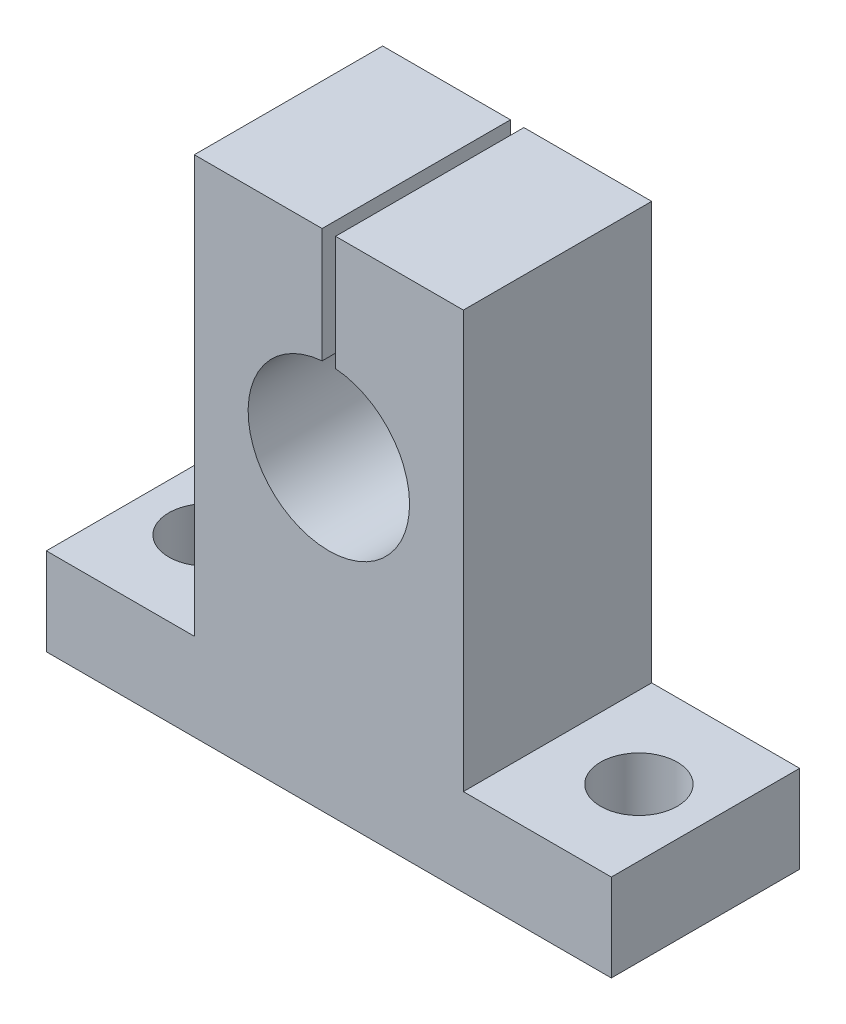
ISO-10303-21;
HEADER;
FILE_DESCRIPTION(('STEP AP214'),'2;1');
FILE_NAME('part.step','',(''),(''),'','','');
FILE_SCHEMA(('AUTOMOTIVE_DESIGN { 1 0 10303 214 1 1 1 1 }'));
ENDSEC;
DATA;
#1=APPLICATION_CONTEXT('core data for automotive mechanical design processes');
#2=APPLICATION_PROTOCOL_DEFINITION('international standard','automotive_design',2000,#1);
#3=PRODUCT_CONTEXT('',#1,'mechanical');
#4=PRODUCT('Part','Part','',(#3));
#5=PRODUCT_RELATED_PRODUCT_CATEGORY('part','',(#4));
#6=PRODUCT_DEFINITION_FORMATION('','',#4);
#7=PRODUCT_DEFINITION_CONTEXT('part definition',#1,'design');
#8=PRODUCT_DEFINITION('design','',#6,#7);
#9=PRODUCT_DEFINITION_SHAPE('','',#8);
#10=(LENGTH_UNIT() NAMED_UNIT(*) SI_UNIT(.MILLI.,.METRE.));
#11=(NAMED_UNIT(*) PLANE_ANGLE_UNIT() SI_UNIT($,.RADIAN.));
#12=(NAMED_UNIT(*) SI_UNIT($,.STERADIAN.) SOLID_ANGLE_UNIT());
#13=UNCERTAINTY_MEASURE_WITH_UNIT(LENGTH_MEASURE(1.E-05),#10,'distance_accuracy_value','');
#14=(GEOMETRIC_REPRESENTATION_CONTEXT(3) GLOBAL_UNCERTAINTY_ASSIGNED_CONTEXT((#13)) GLOBAL_UNIT_ASSIGNED_CONTEXT((#10,
#11,#12)) REPRESENTATION_CONTEXT('',''));
#15=CARTESIAN_POINT('',(0.,0.,0.));
#16=DIRECTION('',(0.,0.,1.));
#17=DIRECTION('',(1.,0.,0.));
#18=AXIS2_PLACEMENT_3D('',#15,#16,#17);
#19=CARTESIAN_POINT('',(-21.,-16.5,14.));
#20=DIRECTION('',(0.,1.,0.));
#21=DIRECTION('',(0.,0.,1.));
#22=AXIS2_PLACEMENT_3D('',#19,#20,#21);
#23=PLANE('',#22);
#24=CARTESIAN_POINT('',(-16.05,-16.5,7.));
#25=DIRECTION('',(0.,1.,0.));
#26=DIRECTION('',(0.,0.,1.));
#27=AXIS2_PLACEMENT_3D('',#24,#25,#26);
#28=CIRCLE('',#27,2.85);
#29=CARTESIAN_POINT('',(-16.05,-16.5,9.85));
#30=VERTEX_POINT('',#29);
#31=EDGE_CURVE('E271',#30,#30,#28,.F.);
#32=ORIENTED_EDGE('',*,*,#31,.T.);
#33=EDGE_LOOP('',(#32));
#34=FACE_BOUND('',#33,.T.);
#35=DIRECTION('',(1.,0.,0.));
#36=VECTOR('',#35,1.);
#37=CARTESIAN_POINT('',(-21.,-16.5,0.));
#38=LINE('',#37,#36);
#39=CARTESIAN_POINT('',(-21.,-16.5,0.));
#40=VERTEX_POINT('',#39);
#41=CARTESIAN_POINT('',(-9.99999999999999,-16.5,0.));
#42=VERTEX_POINT('',#41);
#43=EDGE_CURVE('E154',#40,#42,#38,.T.);
#44=ORIENTED_EDGE('',*,*,#43,.F.);
#45=DIRECTION('',(0.,0.,-1.));
#46=VECTOR('',#45,1.);
#47=CARTESIAN_POINT('',(-21.,-16.5,14.));
#48=LINE('',#47,#46);
#49=CARTESIAN_POINT('',(-21.,-16.5,14.));
#50=VERTEX_POINT('',#49);
#51=EDGE_CURVE('E11',#50,#40,#48,.T.);
#52=ORIENTED_EDGE('',*,*,#51,.F.);
#53=DIRECTION('',(1.,0.,0.));
#54=VECTOR('',#53,1.);
#55=CARTESIAN_POINT('',(-21.,-16.5,14.));
#56=LINE('',#55,#54);
#57=CARTESIAN_POINT('',(-9.99999999999999,-16.5,14.));
#58=VERTEX_POINT('',#57);
#59=EDGE_CURVE('E183',#50,#58,#56,.T.);
#60=ORIENTED_EDGE('',*,*,#59,.T.);
#61=DIRECTION('',(0.,0.,-1.));
#62=VECTOR('',#61,1.);
#63=CARTESIAN_POINT('',(-9.99999999999999,-16.5,14.));
#64=LINE('',#63,#62);
#65=EDGE_CURVE('E103',#58,#42,#64,.T.);
#66=ORIENTED_EDGE('',*,*,#65,.T.);
#67=EDGE_LOOP('',(#44,#52,#60,#66));
#68=FACE_BOUND('',#67,.T.);
#69=ADVANCED_FACE('F35',(#34,#68),#23,.T.);
#70=CARTESIAN_POINT('',(-21.,-23.,14.));
#71=DIRECTION('',(-1.,0.,0.));
#72=DIRECTION('',(0.,0.,1.));
#73=AXIS2_PLACEMENT_3D('',#70,#71,#72);
#74=PLANE('',#73);
#75=DIRECTION('',(0.,1.,0.));
#76=VECTOR('',#75,1.);
#77=CARTESIAN_POINT('',(-21.,-23.,0.));
#78=LINE('',#77,#76);
#79=CARTESIAN_POINT('',(-21.,-23.,0.));
#80=VERTEX_POINT('',#79);
#81=EDGE_CURVE('E181',#80,#40,#78,.T.);
#82=ORIENTED_EDGE('',*,*,#81,.F.);
#83=DIRECTION('',(0.,0.,-1.));
#84=VECTOR('',#83,1.);
#85=CARTESIAN_POINT('',(-21.,-23.,14.));
#86=LINE('',#85,#84);
#87=CARTESIAN_POINT('',(-21.,-23.,14.));
#88=VERTEX_POINT('',#87);
#89=EDGE_CURVE('E44',#88,#80,#86,.T.);
#90=ORIENTED_EDGE('',*,*,#89,.F.);
#91=DIRECTION('',(0.,1.,0.));
#92=VECTOR('',#91,1.);
#93=CARTESIAN_POINT('',(-21.,-23.,14.));
#94=LINE('',#93,#92);
#95=EDGE_CURVE('E149',#88,#50,#94,.T.);
#96=ORIENTED_EDGE('',*,*,#95,.T.);
#97=ORIENTED_EDGE('',*,*,#51,.T.);
#98=EDGE_LOOP('',(#82,#90,#96,#97));
#99=FACE_BOUND('',#98,.T.);
#100=ADVANCED_FACE('F207',(#99),#74,.T.);
#101=CARTESIAN_POINT('',(21.,-23.,14.));
#102=DIRECTION('',(0.,-1.,0.));
#103=DIRECTION('',(0.,0.,-1.));
#104=AXIS2_PLACEMENT_3D('',#101,#102,#103);
#105=PLANE('',#104);
#106=CARTESIAN_POINT('',(-16.05,-23.,7.));
#107=DIRECTION('',(0.,-1.,0.));
#108=DIRECTION('',(0.,0.,-1.));
#109=AXIS2_PLACEMENT_3D('',#106,#107,#108);
#110=CIRCLE('',#109,2.85);
#111=CARTESIAN_POINT('',(-16.05,-23.,9.85));
#112=VERTEX_POINT('',#111);
#113=EDGE_CURVE('E38',#112,#112,#110,.F.);
#114=ORIENTED_EDGE('',*,*,#113,.T.);
#115=EDGE_LOOP('',(#114));
#116=FACE_BOUND('',#115,.T.);
#117=CARTESIAN_POINT('',(16.05,-23.,7.));
#118=DIRECTION('',(0.,-1.,0.));
#119=DIRECTION('',(0.,0.,-1.));
#120=AXIS2_PLACEMENT_3D('',#117,#118,#119);
#121=CIRCLE('',#120,2.85);
#122=CARTESIAN_POINT('',(16.05,-23.,9.85));
#123=VERTEX_POINT('',#122);
#124=EDGE_CURVE('E272',#123,#123,#121,.F.);
#125=ORIENTED_EDGE('',*,*,#124,.T.);
#126=EDGE_LOOP('',(#125));
#127=FACE_BOUND('',#126,.T.);
#128=DIRECTION('',(-1.,0.,0.));
#129=VECTOR('',#128,1.);
#130=CARTESIAN_POINT('',(21.,-23.,0.));
#131=LINE('',#130,#129);
#132=CARTESIAN_POINT('',(21.,-23.,0.));
#133=VERTEX_POINT('',#132);
#134=EDGE_CURVE('E135',#133,#80,#131,.T.);
#135=ORIENTED_EDGE('',*,*,#134,.F.);
#136=DIRECTION('',(0.,0.,-1.));
#137=VECTOR('',#136,1.);
#138=CARTESIAN_POINT('',(21.,-23.,14.));
#139=LINE('',#138,#137);
#140=CARTESIAN_POINT('',(21.,-23.,14.));
#141=VERTEX_POINT('',#140);
#142=EDGE_CURVE('E129',#141,#133,#139,.T.);
#143=ORIENTED_EDGE('',*,*,#142,.F.);
#144=DIRECTION('',(-1.,0.,0.));
#145=VECTOR('',#144,1.);
#146=CARTESIAN_POINT('',(21.,-23.,14.));
#147=LINE('',#146,#145);
#148=EDGE_CURVE('E133',#141,#88,#147,.T.);
#149=ORIENTED_EDGE('',*,*,#148,.T.);
#150=ORIENTED_EDGE('',*,*,#89,.T.);
#151=EDGE_LOOP('',(#135,#143,#149,#150));
#152=FACE_BOUND('',#151,.T.);
#153=ADVANCED_FACE('F131',(#116,#127,#152),#105,.T.);
#154=CARTESIAN_POINT('',(21.,-23.,14.));
#155=DIRECTION('',(-1.,0.,0.));
#156=DIRECTION('',(0.,0.,1.));
#157=AXIS2_PLACEMENT_3D('',#154,#155,#156);
#158=PLANE('',#157);
#159=DIRECTION('',(0.,1.,0.));
#160=VECTOR('',#159,1.);
#161=CARTESIAN_POINT('',(21.,-23.,0.));
#162=LINE('',#161,#160);
#163=CARTESIAN_POINT('',(21.,-16.5,0.));
#164=VERTEX_POINT('',#163);
#165=EDGE_CURVE('E178',#133,#164,#162,.T.);
#166=ORIENTED_EDGE('',*,*,#165,.T.);
#167=DIRECTION('',(0.,0.,-1.));
#168=VECTOR('',#167,1.);
#169=CARTESIAN_POINT('',(21.,-16.5,14.));
#170=LINE('',#169,#168);
#171=CARTESIAN_POINT('',(21.,-16.5,14.));
#172=VERTEX_POINT('',#171);
#173=EDGE_CURVE('E138',#172,#164,#170,.T.);
#174=ORIENTED_EDGE('',*,*,#173,.F.);
#175=DIRECTION('',(0.,1.,0.));
#176=VECTOR('',#175,1.);
#177=CARTESIAN_POINT('',(21.,-23.,14.));
#178=LINE('',#177,#176);
#179=EDGE_CURVE('E141',#141,#172,#178,.T.);
#180=ORIENTED_EDGE('',*,*,#179,.F.);
#181=ORIENTED_EDGE('',*,*,#142,.T.);
#182=EDGE_LOOP('',(#166,#174,#180,#181));
#183=FACE_BOUND('',#182,.T.);
#184=ADVANCED_FACE('F142',(#183),#158,.F.);
#185=CARTESIAN_POINT('',(21.,-16.5,14.));
#186=DIRECTION('',(0.,-1.,0.));
#187=DIRECTION('',(0.,0.,-1.));
#188=AXIS2_PLACEMENT_3D('',#185,#186,#187);
#189=PLANE('',#188);
#190=CARTESIAN_POINT('',(16.05,-16.5,7.));
#191=DIRECTION('',(0.,-1.,0.));
#192=DIRECTION('',(0.,0.,-1.));
#193=AXIS2_PLACEMENT_3D('',#190,#191,#192);
#194=CIRCLE('',#193,2.85);
#195=CARTESIAN_POINT('',(16.05,-16.5,9.85));
#196=VERTEX_POINT('',#195);
#197=EDGE_CURVE('E273',#196,#196,#194,.F.);
#198=ORIENTED_EDGE('',*,*,#197,.F.);
#199=EDGE_LOOP('',(#198));
#200=FACE_BOUND('',#199,.T.);
#201=DIRECTION('',(-1.,0.,0.));
#202=VECTOR('',#201,1.);
#203=CARTESIAN_POINT('',(21.,-16.5,0.));
#204=LINE('',#203,#202);
#205=CARTESIAN_POINT('',(10.,-16.5,0.));
#206=VERTEX_POINT('',#205);
#207=EDGE_CURVE('E176',#164,#206,#204,.T.);
#208=ORIENTED_EDGE('',*,*,#207,.T.);
#209=DIRECTION('',(0.,0.,-1.));
#210=VECTOR('',#209,1.);
#211=CARTESIAN_POINT('',(10.,-16.5,14.));
#212=LINE('',#211,#210);
#213=CARTESIAN_POINT('',(10.,-16.5,14.));
#214=VERTEX_POINT('',#213);
#215=EDGE_CURVE('E187',#214,#206,#212,.T.);
#216=ORIENTED_EDGE('',*,*,#215,.F.);
#217=DIRECTION('',(-1.,0.,0.));
#218=VECTOR('',#217,1.);
#219=CARTESIAN_POINT('',(21.,-16.5,14.));
#220=LINE('',#219,#218);
#221=EDGE_CURVE('E146',#172,#214,#220,.T.);
#222=ORIENTED_EDGE('',*,*,#221,.F.);
#223=ORIENTED_EDGE('',*,*,#173,.T.);
#224=EDGE_LOOP('',(#208,#216,#222,#223));
#225=FACE_BOUND('',#224,.T.);
#226=ADVANCED_FACE('F222',(#200,#225),#189,.F.);
#227=CARTESIAN_POINT('',(10.,-16.5,14.));
#228=DIRECTION('',(-1.,0.,0.));
#229=DIRECTION('',(0.,-1.,0.));
#230=AXIS2_PLACEMENT_3D('',#227,#228,#229);
#231=PLANE('',#230);
#232=DIRECTION('',(0.,1.,0.));
#233=VECTOR('',#232,1.);
#234=CARTESIAN_POINT('',(10.,-16.5,0.));
#235=LINE('',#234,#233);
#236=CARTESIAN_POINT('',(10.,14.5,0.));
#237=VERTEX_POINT('',#236);
#238=EDGE_CURVE('E174',#206,#237,#235,.T.);
#239=ORIENTED_EDGE('',*,*,#238,.T.);
#240=DIRECTION('',(0.,0.,-1.));
#241=VECTOR('',#240,1.);
#242=CARTESIAN_POINT('',(10.,14.5,14.));
#243=LINE('',#242,#241);
#244=CARTESIAN_POINT('',(10.,14.5,14.));
#245=VERTEX_POINT('',#244);
#246=EDGE_CURVE('E190',#245,#237,#243,.T.);
#247=ORIENTED_EDGE('',*,*,#246,.F.);
#248=DIRECTION('',(0.,1.,0.));
#249=VECTOR('',#248,1.);
#250=CARTESIAN_POINT('',(10.,-16.5,14.));
#251=LINE('',#250,#249);
#252=EDGE_CURVE('E296',#214,#245,#251,.T.);
#253=ORIENTED_EDGE('',*,*,#252,.F.);
#254=ORIENTED_EDGE('',*,*,#215,.T.);
#255=EDGE_LOOP('',(#239,#247,#253,#254));
#256=FACE_BOUND('',#255,.T.);
#257=ADVANCED_FACE('F225',(#256),#231,.F.);
#258=CARTESIAN_POINT('',(10.,14.5,14.));
#259=DIRECTION('',(0.,-1.,0.));
#260=DIRECTION('',(1.,0.,0.));
#261=AXIS2_PLACEMENT_3D('',#258,#259,#260);
#262=PLANE('',#261);
#263=DIRECTION('',(-1.,0.,0.));
#264=VECTOR('',#263,1.);
#265=CARTESIAN_POINT('',(10.,14.5,0.));
#266=LINE('',#265,#264);
#267=CARTESIAN_POINT('',(0.500000000000011,14.5,0.));
#268=VERTEX_POINT('',#267);
#269=EDGE_CURVE('E172',#237,#268,#266,.T.);
#270=ORIENTED_EDGE('',*,*,#269,.T.);
#271=DIRECTION('',(0.,0.,-1.));
#272=VECTOR('',#271,1.);
#273=CARTESIAN_POINT('',(0.500000000000011,14.5,14.));
#274=LINE('',#273,#272);
#275=CARTESIAN_POINT('',(0.500000000000011,14.5,14.));
#276=VERTEX_POINT('',#275);
#277=EDGE_CURVE('E193',#276,#268,#274,.T.);
#278=ORIENTED_EDGE('',*,*,#277,.F.);
#279=DIRECTION('',(-1.,0.,0.));
#280=VECTOR('',#279,1.);
#281=CARTESIAN_POINT('',(10.,14.5,14.));
#282=LINE('',#281,#280);
#283=EDGE_CURVE('E294',#245,#276,#282,.T.);
#284=ORIENTED_EDGE('',*,*,#283,.F.);
#285=ORIENTED_EDGE('',*,*,#246,.T.);
#286=EDGE_LOOP('',(#270,#278,#284,#285));
#287=FACE_BOUND('',#286,.T.);
#288=ADVANCED_FACE('F229',(#287),#262,.F.);
#289=CARTESIAN_POINT('',(0.500000000000011,14.5,14.));
#290=DIRECTION('',(1.,0.,0.));
#291=DIRECTION('',(0.,1.,0.));
#292=AXIS2_PLACEMENT_3D('',#289,#290,#291);
#293=PLANE('',#292);
#294=DIRECTION('',(0.,-1.,0.));
#295=VECTOR('',#294,1.);
#296=CARTESIAN_POINT('',(0.500000000000011,14.5,0.));
#297=LINE('',#296,#295);
#298=CARTESIAN_POINT('',(0.500000000000009,5.9791303715507,0.));
#299=VERTEX_POINT('',#298);
#300=EDGE_CURVE('E169',#268,#299,#297,.T.);
#301=ORIENTED_EDGE('',*,*,#300,.T.);
#302=DIRECTION('',(0.,0.,-1.));
#303=VECTOR('',#302,1.);
#304=CARTESIAN_POINT('',(0.500000000000009,5.9791303715507,14.));
#305=LINE('',#304,#303);
#306=CARTESIAN_POINT('',(0.500000000000009,5.9791303715507,14.));
#307=VERTEX_POINT('',#306);
#308=EDGE_CURVE('E196',#307,#299,#305,.T.);
#309=ORIENTED_EDGE('',*,*,#308,.F.);
#310=DIRECTION('',(0.,-1.,0.));
#311=VECTOR('',#310,1.);
#312=CARTESIAN_POINT('',(0.500000000000011,14.5,14.));
#313=LINE('',#312,#311);
#314=EDGE_CURVE('E292',#276,#307,#313,.T.);
#315=ORIENTED_EDGE('',*,*,#314,.F.);
#316=ORIENTED_EDGE('',*,*,#277,.T.);
#317=EDGE_LOOP('',(#301,#309,#315,#316));
#318=FACE_BOUND('',#317,.T.);
#319=ADVANCED_FACE('F233',(#318),#293,.F.);
#320=CARTESIAN_POINT('',(0.,0.,14.));
#321=DIRECTION('',(0.,0.,-1.));
#322=DIRECTION('',(-1.,0.,0.));
#323=AXIS2_PLACEMENT_3D('',#320,#321,#322);
#324=CYLINDRICAL_SURFACE('',#323,6.);
#325=CARTESIAN_POINT('',(0.,0.,0.));
#326=DIRECTION('',(0.,0.,1.));
#327=DIRECTION('',(1.,0.,0.));
#328=AXIS2_PLACEMENT_3D('',#325,#326,#327);
#329=CIRCLE('',#328,6.);
#330=CARTESIAN_POINT('',(-0.49999999999999,5.9791303715507,0.));
#331=VERTEX_POINT('',#330);
#332=EDGE_CURVE('E166',#331,#299,#329,.T.);
#333=ORIENTED_EDGE('',*,*,#332,.F.);
#334=DIRECTION('',(0.,0.,-1.));
#335=VECTOR('',#334,1.);
#336=CARTESIAN_POINT('',(-0.49999999999999,5.9791303715507,14.));
#337=LINE('',#336,#335);
#338=CARTESIAN_POINT('',(-0.49999999999999,5.9791303715507,14.));
#339=VERTEX_POINT('',#338);
#340=EDGE_CURVE('E198',#339,#331,#337,.T.);
#341=ORIENTED_EDGE('',*,*,#340,.F.);
#342=CARTESIAN_POINT('',(0.,0.,14.));
#343=DIRECTION('',(0.,0.,1.));
#344=DIRECTION('',(1.,0.,0.));
#345=AXIS2_PLACEMENT_3D('',#342,#343,#344);
#346=CIRCLE('',#345,6.);
#347=EDGE_CURVE('E289',#339,#307,#346,.T.);
#348=ORIENTED_EDGE('',*,*,#347,.T.);
#349=ORIENTED_EDGE('',*,*,#308,.T.);
#350=EDGE_LOOP('',(#333,#341,#348,#349));
#351=FACE_BOUND('',#350,.T.);
#352=ADVANCED_FACE('F237',(#351),#324,.F.);
#353=CARTESIAN_POINT('',(-0.49999999999999,14.5,14.));
#354=DIRECTION('',(1.,0.,0.));
#355=DIRECTION('',(0.,0.,-1.));
#356=AXIS2_PLACEMENT_3D('',#353,#354,#355);
#357=PLANE('',#356);
#358=DIRECTION('',(0.,-1.,0.));
#359=VECTOR('',#358,1.);
#360=CARTESIAN_POINT('',(-0.49999999999999,14.5,0.));
#361=LINE('',#360,#359);
#362=CARTESIAN_POINT('',(-0.49999999999999,14.5,0.));
#363=VERTEX_POINT('',#362);
#364=EDGE_CURVE('E163',#363,#331,#361,.T.);
#365=ORIENTED_EDGE('',*,*,#364,.F.);
#366=DIRECTION('',(0.,0.,-1.));
#367=VECTOR('',#366,1.);
#368=CARTESIAN_POINT('',(-0.49999999999999,14.5,14.));
#369=LINE('',#368,#367);
#370=CARTESIAN_POINT('',(-0.49999999999999,14.5,14.));
#371=VERTEX_POINT('',#370);
#372=EDGE_CURVE('E200',#371,#363,#369,.T.);
#373=ORIENTED_EDGE('',*,*,#372,.F.);
#374=DIRECTION('',(0.,-1.,0.));
#375=VECTOR('',#374,1.);
#376=CARTESIAN_POINT('',(-0.49999999999999,14.5,14.));
#377=LINE('',#376,#375);
#378=EDGE_CURVE('E286',#371,#339,#377,.T.);
#379=ORIENTED_EDGE('',*,*,#378,.T.);
#380=ORIENTED_EDGE('',*,*,#340,.T.);
#381=EDGE_LOOP('',(#365,#373,#379,#380));
#382=FACE_BOUND('',#381,.T.);
#383=ADVANCED_FACE('F241',(#382),#357,.T.);
#384=CARTESIAN_POINT('',(-9.99999999999999,14.5,14.));
#385=DIRECTION('',(0.,1.,0.));
#386=DIRECTION('',(-1.,0.,0.));
#387=AXIS2_PLACEMENT_3D('',#384,#385,#386);
#388=PLANE('',#387);
#389=DIRECTION('',(1.,0.,0.));
#390=VECTOR('',#389,1.);
#391=CARTESIAN_POINT('',(-9.99999999999999,14.5,0.));
#392=LINE('',#391,#390);
#393=CARTESIAN_POINT('',(-9.99999999999999,14.5,0.));
#394=VERTEX_POINT('',#393);
#395=EDGE_CURVE('E160',#394,#363,#392,.T.);
#396=ORIENTED_EDGE('',*,*,#395,.F.);
#397=DIRECTION('',(0.,0.,-1.));
#398=VECTOR('',#397,1.);
#399=CARTESIAN_POINT('',(-9.99999999999999,14.5,14.));
#400=LINE('',#399,#398);
#401=CARTESIAN_POINT('',(-9.99999999999999,14.5,14.));
#402=VERTEX_POINT('',#401);
#403=EDGE_CURVE('E202',#402,#394,#400,.T.);
#404=ORIENTED_EDGE('',*,*,#403,.F.);
#405=DIRECTION('',(1.,0.,0.));
#406=VECTOR('',#405,1.);
#407=CARTESIAN_POINT('',(-9.99999999999999,14.5,14.));
#408=LINE('',#407,#406);
#409=EDGE_CURVE('E283',#402,#371,#408,.T.);
#410=ORIENTED_EDGE('',*,*,#409,.T.);
#411=ORIENTED_EDGE('',*,*,#372,.T.);
#412=EDGE_LOOP('',(#396,#404,#410,#411));
#413=FACE_BOUND('',#412,.T.);
#414=ADVANCED_FACE('F245',(#413),#388,.T.);
#415=CARTESIAN_POINT('',(-9.99999999999999,-16.5,14.));
#416=DIRECTION('',(-1.,0.,0.));
#417=DIRECTION('',(0.,0.,1.));
#418=AXIS2_PLACEMENT_3D('',#415,#416,#417);
#419=PLANE('',#418);
#420=DIRECTION('',(0.,1.,0.));
#421=VECTOR('',#420,1.);
#422=CARTESIAN_POINT('',(-9.99999999999999,-16.5,0.));
#423=LINE('',#422,#421);
#424=EDGE_CURVE('E157',#42,#394,#423,.T.);
#425=ORIENTED_EDGE('',*,*,#424,.F.);
#426=ORIENTED_EDGE('',*,*,#65,.F.);
#427=DIRECTION('',(0.,1.,0.));
#428=VECTOR('',#427,1.);
#429=CARTESIAN_POINT('',(-9.99999999999999,-16.5,14.));
#430=LINE('',#429,#428);
#431=EDGE_CURVE('E281',#58,#402,#430,.T.);
#432=ORIENTED_EDGE('',*,*,#431,.T.);
#433=ORIENTED_EDGE('',*,*,#403,.T.);
#434=EDGE_LOOP('',(#425,#426,#432,#433));
#435=FACE_BOUND('',#434,.T.);
#436=ADVANCED_FACE('F203',(#435),#419,.T.);
#437=CARTESIAN_POINT('',(0.,0.,14.));
#438=DIRECTION('',(0.,0.,1.));
#439=DIRECTION('',(1.,0.,0.));
#440=AXIS2_PLACEMENT_3D('',#437,#438,#439);
#441=PLANE('',#440);
#442=ORIENTED_EDGE('',*,*,#59,.F.);
#443=ORIENTED_EDGE('',*,*,#95,.F.);
#444=ORIENTED_EDGE('',*,*,#148,.F.);
#445=ORIENTED_EDGE('',*,*,#179,.T.);
#446=ORIENTED_EDGE('',*,*,#221,.T.);
#447=ORIENTED_EDGE('',*,*,#252,.T.);
#448=ORIENTED_EDGE('',*,*,#283,.T.);
#449=ORIENTED_EDGE('',*,*,#314,.T.);
#450=ORIENTED_EDGE('',*,*,#347,.F.);
#451=ORIENTED_EDGE('',*,*,#378,.F.);
#452=ORIENTED_EDGE('',*,*,#409,.F.);
#453=ORIENTED_EDGE('',*,*,#431,.F.);
#454=EDGE_LOOP('',(#442,#443,#444,#445,#446,#447,#448,#449,#450,#451,#452,#453));
#455=FACE_BOUND('',#454,.T.);
#456=ADVANCED_FACE('F148',(#455),#441,.T.);
#457=CARTESIAN_POINT('',(0.,0.,0.));
#458=DIRECTION('',(0.,0.,1.));
#459=DIRECTION('',(1.,0.,0.));
#460=AXIS2_PLACEMENT_3D('',#457,#458,#459);
#461=PLANE('',#460);
#462=ORIENTED_EDGE('',*,*,#43,.T.);
#463=ORIENTED_EDGE('',*,*,#424,.T.);
#464=ORIENTED_EDGE('',*,*,#395,.T.);
#465=ORIENTED_EDGE('',*,*,#364,.T.);
#466=ORIENTED_EDGE('',*,*,#332,.T.);
#467=ORIENTED_EDGE('',*,*,#300,.F.);
#468=ORIENTED_EDGE('',*,*,#269,.F.);
#469=ORIENTED_EDGE('',*,*,#238,.F.);
#470=ORIENTED_EDGE('',*,*,#207,.F.);
#471=ORIENTED_EDGE('',*,*,#165,.F.);
#472=ORIENTED_EDGE('',*,*,#134,.T.);
#473=ORIENTED_EDGE('',*,*,#81,.T.);
#474=EDGE_LOOP('',(#462,#463,#464,#465,#466,#467,#468,#469,#470,#471,#472,#473));
#475=FACE_BOUND('',#474,.T.);
#476=ADVANCED_FACE('F206',(#475),#461,.F.);
#477=CARTESIAN_POINT('',(16.05,-23.000012,7.));
#478=DIRECTION('',(0.,1.,0.));
#479=DIRECTION('',(0.,0.,1.));
#480=AXIS2_PLACEMENT_3D('',#477,#478,#479);
#481=CYLINDRICAL_SURFACE('',#480,2.85);
#482=CARTESIAN_POINT('',(16.05,-23.,9.85));
#483=CARTESIAN_POINT('',(16.05,-22.9322916666667,9.85));
#484=CARTESIAN_POINT('',(16.05,-22.8645833333333,9.85));
#485=CARTESIAN_POINT('',(16.05,-22.7291666666667,9.85));
#486=CARTESIAN_POINT('',(16.05,-22.6614583333333,9.85));
#487=CARTESIAN_POINT('',(16.05,-22.5260416666667,9.85));
#488=CARTESIAN_POINT('',(16.05,-22.4583333333333,9.85));
#489=CARTESIAN_POINT('',(16.05,-22.3229166666667,9.85));
#490=CARTESIAN_POINT('',(16.05,-22.2552083333333,9.85));
#491=CARTESIAN_POINT('',(16.05,-22.1197916666667,9.85));
#492=CARTESIAN_POINT('',(16.05,-22.0520833333333,9.85));
#493=CARTESIAN_POINT('',(16.05,-21.9166666666667,9.85));
#494=CARTESIAN_POINT('',(16.05,-21.8489583333333,9.85));
#495=CARTESIAN_POINT('',(16.05,-21.7135416666667,9.85));
#496=CARTESIAN_POINT('',(16.05,-21.6458333333333,9.85));
#497=CARTESIAN_POINT('',(16.05,-21.5104166666667,9.85));
#498=CARTESIAN_POINT('',(16.05,-21.4427083333333,9.85));
#499=CARTESIAN_POINT('',(16.05,-21.3072916666667,9.85));
#500=CARTESIAN_POINT('',(16.05,-21.2395833333333,9.85));
#501=CARTESIAN_POINT('',(16.05,-21.1041666666667,9.85));
#502=CARTESIAN_POINT('',(16.05,-21.0364583333333,9.85));
#503=CARTESIAN_POINT('',(16.05,-20.9010416666667,9.85));
#504=CARTESIAN_POINT('',(16.05,-20.8333333333333,9.85));
#505=CARTESIAN_POINT('',(16.05,-20.6979166666667,9.85));
#506=CARTESIAN_POINT('',(16.05,-20.6302083333333,9.85));
#507=CARTESIAN_POINT('',(16.05,-20.4947916666667,9.85));
#508=CARTESIAN_POINT('',(16.05,-20.4270833333333,9.85));
#509=CARTESIAN_POINT('',(16.05,-20.2916666666667,9.85));
#510=CARTESIAN_POINT('',(16.05,-20.2239583333333,9.85));
#511=CARTESIAN_POINT('',(16.05,-20.0885416666667,9.85));
#512=CARTESIAN_POINT('',(16.05,-20.0208333333333,9.85));
#513=CARTESIAN_POINT('',(16.05,-19.8854166666667,9.85));
#514=CARTESIAN_POINT('',(16.05,-19.8177083333333,9.85));
#515=CARTESIAN_POINT('',(16.05,-19.6822916666667,9.85));
#516=CARTESIAN_POINT('',(16.05,-19.6145833333333,9.85));
#517=CARTESIAN_POINT('',(16.05,-19.4791666666667,9.85));
#518=CARTESIAN_POINT('',(16.05,-19.4114583333333,9.85));
#519=CARTESIAN_POINT('',(16.05,-19.2760416666667,9.85));
#520=CARTESIAN_POINT('',(16.05,-19.2083333333333,9.85));
#521=CARTESIAN_POINT('',(16.05,-19.0729166666667,9.85));
#522=CARTESIAN_POINT('',(16.05,-19.0052083333333,9.85));
#523=CARTESIAN_POINT('',(16.05,-18.8697916666667,9.85));
#524=CARTESIAN_POINT('',(16.05,-18.8020833333333,9.85));
#525=CARTESIAN_POINT('',(16.05,-18.6666666666667,9.85));
#526=CARTESIAN_POINT('',(16.05,-18.5989583333333,9.85));
#527=CARTESIAN_POINT('',(16.05,-18.4635416666667,9.85));
#528=CARTESIAN_POINT('',(16.05,-18.3958333333333,9.85));
#529=CARTESIAN_POINT('',(16.05,-18.2604166666667,9.85));
#530=CARTESIAN_POINT('',(16.05,-18.1927083333333,9.85));
#531=CARTESIAN_POINT('',(16.05,-18.0572916666667,9.85));
#532=CARTESIAN_POINT('',(16.05,-17.9895833333333,9.85));
#533=CARTESIAN_POINT('',(16.05,-17.8541666666667,9.85));
#534=CARTESIAN_POINT('',(16.05,-17.7864583333333,9.85));
#535=CARTESIAN_POINT('',(16.05,-17.6510416666667,9.85));
#536=CARTESIAN_POINT('',(16.05,-17.5833333333333,9.85));
#537=CARTESIAN_POINT('',(16.05,-17.4479166666667,9.85));
#538=CARTESIAN_POINT('',(16.05,-17.3802083333333,9.85));
#539=CARTESIAN_POINT('',(16.05,-17.2447916666667,9.85));
#540=CARTESIAN_POINT('',(16.05,-17.1770833333333,9.85));
#541=CARTESIAN_POINT('',(16.05,-17.0416666666667,9.85));
#542=CARTESIAN_POINT('',(16.05,-16.9739583333333,9.85));
#543=CARTESIAN_POINT('',(16.05,-16.8385416666667,9.85));
#544=CARTESIAN_POINT('',(16.05,-16.7708333333333,9.85));
#545=CARTESIAN_POINT('',(16.05,-16.6354166666667,9.85));
#546=CARTESIAN_POINT('',(16.05,-16.5677083333333,9.85));
#547=CARTESIAN_POINT('',(16.05,-16.5,9.85));
#548=B_SPLINE_CURVE_WITH_KNOTS('',3,(#482,#483,#484,#485,#486,#487,#488,#489,#490,#491,#492,
#493,#494,#495,#496,#497,#498,#499,#500,#501,#502,#503,#504,#505,#506,#507,#508,#509,#510,#511,
#512,#513,#514,#515,#516,#517,#518,#519,#520,#521,#522,#523,#524,#525,#526,#527,#528,#529,#530,
#531,#532,#533,#534,#535,#536,#537,#538,#539,#540,#541,#542,#543,#544,#545,#546,#547),
.UNSPECIFIED.,.F.,.F.,(4,2,2,2,2,2,2,2,2,2,2,2,2,2,2,2,2,2,2,2,2,2,2,2,2,2,2,2,2,2,2,2,4),(0.,
0.203125000000002,0.40625,0.609375000000002,0.812500000000001,1.015625,1.21875,1.421875,1.625,
1.828125,2.03125,2.234375,2.4375,2.640625,2.84375,3.046875,3.25,3.453125,3.65625,3.859375,
4.0625,4.265625,4.46875,4.671875,4.875,5.078125,5.28125,5.484375,5.6875,5.890625,6.09375,
6.296875,6.5),.UNSPECIFIED.);
#549=EDGE_CURVE('BSEAM256',#123,#196,#548,.T.);
#550=ORIENTED_EDGE('',*,*,#124,.F.);
#551=ORIENTED_EDGE('',*,*,#197,.T.);
#552=ORIENTED_EDGE('',*,*,#549,.T.);
#553=ORIENTED_EDGE('',*,*,#549,.F.);
#554=EDGE_LOOP('',(#550,#552,#551,#553));
#555=FACE_BOUND('',#554,.T.);
#556=ADVANCED_FACE('F256',(#555),#481,.F.);
#557=CARTESIAN_POINT('',(-16.05,-23.000012,7.));
#558=DIRECTION('',(0.,1.,0.));
#559=DIRECTION('',(0.,0.,1.));
#560=AXIS2_PLACEMENT_3D('',#557,#558,#559);
#561=CYLINDRICAL_SURFACE('',#560,2.85);
#562=CARTESIAN_POINT('',(-16.05,-23.,9.85));
#563=CARTESIAN_POINT('',(-16.05,-22.9322916666667,9.85));
#564=CARTESIAN_POINT('',(-16.05,-22.8645833333333,9.85));
#565=CARTESIAN_POINT('',(-16.05,-22.7291666666667,9.85));
#566=CARTESIAN_POINT('',(-16.05,-22.6614583333333,9.85));
#567=CARTESIAN_POINT('',(-16.05,-22.5260416666667,9.85));
#568=CARTESIAN_POINT('',(-16.05,-22.4583333333333,9.85));
#569=CARTESIAN_POINT('',(-16.05,-22.3229166666667,9.85));
#570=CARTESIAN_POINT('',(-16.05,-22.2552083333333,9.85));
#571=CARTESIAN_POINT('',(-16.05,-22.1197916666667,9.85));
#572=CARTESIAN_POINT('',(-16.05,-22.0520833333333,9.85));
#573=CARTESIAN_POINT('',(-16.05,-21.9166666666667,9.85));
#574=CARTESIAN_POINT('',(-16.05,-21.8489583333333,9.85));
#575=CARTESIAN_POINT('',(-16.05,-21.7135416666667,9.85));
#576=CARTESIAN_POINT('',(-16.05,-21.6458333333333,9.85));
#577=CARTESIAN_POINT('',(-16.05,-21.5104166666667,9.85));
#578=CARTESIAN_POINT('',(-16.05,-21.4427083333333,9.85));
#579=CARTESIAN_POINT('',(-16.05,-21.3072916666667,9.85));
#580=CARTESIAN_POINT('',(-16.05,-21.2395833333333,9.85));
#581=CARTESIAN_POINT('',(-16.05,-21.1041666666667,9.85));
#582=CARTESIAN_POINT('',(-16.05,-21.0364583333333,9.85));
#583=CARTESIAN_POINT('',(-16.05,-20.9010416666667,9.85));
#584=CARTESIAN_POINT('',(-16.05,-20.8333333333333,9.85));
#585=CARTESIAN_POINT('',(-16.05,-20.6979166666667,9.85));
#586=CARTESIAN_POINT('',(-16.05,-20.6302083333333,9.85));
#587=CARTESIAN_POINT('',(-16.05,-20.4947916666667,9.85));
#588=CARTESIAN_POINT('',(-16.05,-20.4270833333333,9.85));
#589=CARTESIAN_POINT('',(-16.05,-20.2916666666667,9.85));
#590=CARTESIAN_POINT('',(-16.05,-20.2239583333333,9.85));
#591=CARTESIAN_POINT('',(-16.05,-20.0885416666667,9.85));
#592=CARTESIAN_POINT('',(-16.05,-20.0208333333333,9.85));
#593=CARTESIAN_POINT('',(-16.05,-19.8854166666667,9.85));
#594=CARTESIAN_POINT('',(-16.05,-19.8177083333333,9.85));
#595=CARTESIAN_POINT('',(-16.05,-19.6822916666667,9.85));
#596=CARTESIAN_POINT('',(-16.05,-19.6145833333333,9.85));
#597=CARTESIAN_POINT('',(-16.05,-19.4791666666667,9.85));
#598=CARTESIAN_POINT('',(-16.05,-19.4114583333333,9.85));
#599=CARTESIAN_POINT('',(-16.05,-19.2760416666667,9.85));
#600=CARTESIAN_POINT('',(-16.05,-19.2083333333333,9.85));
#601=CARTESIAN_POINT('',(-16.05,-19.0729166666667,9.85));
#602=CARTESIAN_POINT('',(-16.05,-19.0052083333333,9.85));
#603=CARTESIAN_POINT('',(-16.05,-18.8697916666667,9.85));
#604=CARTESIAN_POINT('',(-16.05,-18.8020833333333,9.85));
#605=CARTESIAN_POINT('',(-16.05,-18.6666666666667,9.85));
#606=CARTESIAN_POINT('',(-16.05,-18.5989583333333,9.85));
#607=CARTESIAN_POINT('',(-16.05,-18.4635416666667,9.85));
#608=CARTESIAN_POINT('',(-16.05,-18.3958333333333,9.85));
#609=CARTESIAN_POINT('',(-16.05,-18.2604166666667,9.85));
#610=CARTESIAN_POINT('',(-16.05,-18.1927083333333,9.85));
#611=CARTESIAN_POINT('',(-16.05,-18.0572916666667,9.85));
#612=CARTESIAN_POINT('',(-16.05,-17.9895833333333,9.85));
#613=CARTESIAN_POINT('',(-16.05,-17.8541666666667,9.85));
#614=CARTESIAN_POINT('',(-16.05,-17.7864583333333,9.85));
#615=CARTESIAN_POINT('',(-16.05,-17.6510416666667,9.85));
#616=CARTESIAN_POINT('',(-16.05,-17.5833333333333,9.85));
#617=CARTESIAN_POINT('',(-16.05,-17.4479166666667,9.85));
#618=CARTESIAN_POINT('',(-16.05,-17.3802083333333,9.85));
#619=CARTESIAN_POINT('',(-16.05,-17.2447916666667,9.85));
#620=CARTESIAN_POINT('',(-16.05,-17.1770833333333,9.85));
#621=CARTESIAN_POINT('',(-16.05,-17.0416666666667,9.85));
#622=CARTESIAN_POINT('',(-16.05,-16.9739583333333,9.85));
#623=CARTESIAN_POINT('',(-16.05,-16.8385416666667,9.85));
#624=CARTESIAN_POINT('',(-16.05,-16.7708333333333,9.85));
#625=CARTESIAN_POINT('',(-16.05,-16.6354166666667,9.85));
#626=CARTESIAN_POINT('',(-16.05,-16.5677083333333,9.85));
#627=CARTESIAN_POINT('',(-16.05,-16.5,9.85));
#628=B_SPLINE_CURVE_WITH_KNOTS('',3,(#562,#563,#564,#565,#566,#567,#568,#569,#570,#571,#572,
#573,#574,#575,#576,#577,#578,#579,#580,#581,#582,#583,#584,#585,#586,#587,#588,#589,#590,#591,
#592,#593,#594,#595,#596,#597,#598,#599,#600,#601,#602,#603,#604,#605,#606,#607,#608,#609,#610,
#611,#612,#613,#614,#615,#616,#617,#618,#619,#620,#621,#622,#623,#624,#625,#626,#627),
.UNSPECIFIED.,.F.,.F.,(4,2,2,2,2,2,2,2,2,2,2,2,2,2,2,2,2,2,2,2,2,2,2,2,2,2,2,2,2,2,2,2,4),(0.,
0.203125000000002,0.40625,0.609375000000002,0.812500000000001,1.015625,1.21875,1.421875,1.625,
1.828125,2.03125,2.234375,2.4375,2.640625,2.84375,3.046875,3.25,3.453125,3.65625,3.859375,
4.0625,4.265625,4.46875,4.671875,4.875,5.078125,5.28125,5.484375,5.6875,5.890625,6.09375,
6.296875,6.5),.UNSPECIFIED.);
#629=EDGE_CURVE('BSEAM260',#112,#30,#628,.T.);
#630=ORIENTED_EDGE('',*,*,#113,.F.);
#631=ORIENTED_EDGE('',*,*,#31,.F.);
#632=ORIENTED_EDGE('',*,*,#629,.T.);
#633=ORIENTED_EDGE('',*,*,#629,.F.);
#634=EDGE_LOOP('',(#630,#632,#631,#633));
#635=FACE_BOUND('',#634,.T.);
#636=ADVANCED_FACE('F260',(#635),#561,.F.);
#637=CLOSED_SHELL('',(#69,#100,#153,#184,#226,#257,#288,#319,#352,#383,#414,#436,#456,#476,#556,#636));
#638=MANIFOLD_SOLID_BREP('B2',#637);
#639=ADVANCED_BREP_SHAPE_REPRESENTATION('',(#18,#638),#14);
#640=SHAPE_DEFINITION_REPRESENTATION(#9,#639);
ENDSEC;
END-ISO-10303-21;
